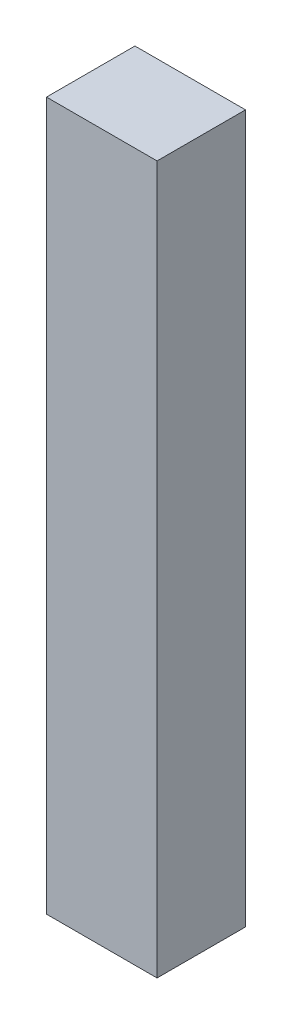
ISO-10303-21;
HEADER;
FILE_DESCRIPTION(('STEP AP214'),'2;1');
FILE_NAME('part.step','',(''),(''),'','','');
FILE_SCHEMA(('AUTOMOTIVE_DESIGN { 1 0 10303 214 1 1 1 1 }'));
ENDSEC;
DATA;
#1=APPLICATION_CONTEXT('core data for automotive mechanical design processes');
#2=APPLICATION_PROTOCOL_DEFINITION('international standard','automotive_design',2000,#1);
#3=PRODUCT_CONTEXT('',#1,'mechanical');
#4=PRODUCT('Part','Part','',(#3));
#5=PRODUCT_RELATED_PRODUCT_CATEGORY('part','',(#4));
#6=PRODUCT_DEFINITION_FORMATION('','',#4);
#7=PRODUCT_DEFINITION_CONTEXT('part definition',#1,'design');
#8=PRODUCT_DEFINITION('design','',#6,#7);
#9=PRODUCT_DEFINITION_SHAPE('','',#8);
#10=(LENGTH_UNIT() NAMED_UNIT(*) SI_UNIT(.MILLI.,.METRE.));
#11=(NAMED_UNIT(*) PLANE_ANGLE_UNIT() SI_UNIT($,.RADIAN.));
#12=(NAMED_UNIT(*) SI_UNIT($,.STERADIAN.) SOLID_ANGLE_UNIT());
#13=UNCERTAINTY_MEASURE_WITH_UNIT(LENGTH_MEASURE(1.E-05),#10,'distance_accuracy_value','');
#14=(GEOMETRIC_REPRESENTATION_CONTEXT(3) GLOBAL_UNCERTAINTY_ASSIGNED_CONTEXT((#13)) GLOBAL_UNIT_ASSIGNED_CONTEXT((#10,
#11,#12)) REPRESENTATION_CONTEXT('',''));
#15=CARTESIAN_POINT('',(0.,0.,0.));
#16=DIRECTION('',(0.,0.,1.));
#17=DIRECTION('',(1.,0.,0.));
#18=AXIS2_PLACEMENT_3D('',#15,#16,#17);
#19=CARTESIAN_POINT('',(125.,800.,200.));
#20=DIRECTION('',(-1.,0.,0.));
#21=DIRECTION('',(0.,-1.,0.));
#22=AXIS2_PLACEMENT_3D('',#19,#20,#21);
#23=PLANE('',#22);
#24=DIRECTION('',(0.,1.,0.));
#25=VECTOR('',#24,1.);
#26=CARTESIAN_POINT('',(125.,800.,0.));
#27=LINE('',#26,#25);
#28=CARTESIAN_POINT('',(125.,-800.,0.));
#29=VERTEX_POINT('',#28);
#30=CARTESIAN_POINT('',(125.,800.,0.));
#31=VERTEX_POINT('',#30);
#32=EDGE_CURVE('E107',#29,#31,#27,.T.);
#33=ORIENTED_EDGE('',*,*,#32,.T.);
#34=DIRECTION('',(0.,0.,-1.));
#35=VECTOR('',#34,1.);
#36=CARTESIAN_POINT('',(125.,800.,200.));
#37=LINE('',#36,#35);
#38=CARTESIAN_POINT('',(125.,800.,200.));
#39=VERTEX_POINT('',#38);
#40=EDGE_CURVE('E11',#39,#31,#37,.T.);
#41=ORIENTED_EDGE('',*,*,#40,.F.);
#42=DIRECTION('',(0.,1.,0.));
#43=VECTOR('',#42,1.);
#44=CARTESIAN_POINT('',(125.,800.,200.));
#45=LINE('',#44,#43);
#46=CARTESIAN_POINT('',(125.,-800.,200.));
#47=VERTEX_POINT('',#46);
#48=EDGE_CURVE('E91',#47,#39,#45,.T.);
#49=ORIENTED_EDGE('',*,*,#48,.F.);
#50=DIRECTION('',(0.,0.,-1.));
#51=VECTOR('',#50,1.);
#52=CARTESIAN_POINT('',(125.,-800.,200.));
#53=LINE('',#52,#51);
#54=EDGE_CURVE('E103',#47,#29,#53,.T.);
#55=ORIENTED_EDGE('',*,*,#54,.T.);
#56=EDGE_LOOP('',(#33,#41,#49,#55));
#57=FACE_BOUND('',#56,.T.);
#58=ADVANCED_FACE('F39',(#57),#23,.F.);
#59=CARTESIAN_POINT('',(-125.,800.,200.));
#60=DIRECTION('',(0.,-1.,0.));
#61=DIRECTION('',(0.,0.,-1.));
#62=AXIS2_PLACEMENT_3D('',#59,#60,#61);
#63=PLANE('',#62);
#64=DIRECTION('',(-1.,0.,0.));
#65=VECTOR('',#64,1.);
#66=CARTESIAN_POINT('',(-125.,800.,0.));
#67=LINE('',#66,#65);
#68=CARTESIAN_POINT('',(-125.,800.,0.));
#69=VERTEX_POINT('',#68);
#70=EDGE_CURVE('E96',#31,#69,#67,.T.);
#71=ORIENTED_EDGE('',*,*,#70,.T.);
#72=DIRECTION('',(0.,0.,-1.));
#73=VECTOR('',#72,1.);
#74=CARTESIAN_POINT('',(-125.,800.,200.));
#75=LINE('',#74,#73);
#76=CARTESIAN_POINT('',(-125.,800.,200.));
#77=VERTEX_POINT('',#76);
#78=EDGE_CURVE('E48',#77,#69,#75,.T.);
#79=ORIENTED_EDGE('',*,*,#78,.F.);
#80=DIRECTION('',(-1.,0.,0.));
#81=VECTOR('',#80,1.);
#82=CARTESIAN_POINT('',(-125.,800.,200.));
#83=LINE('',#82,#81);
#84=EDGE_CURVE('E86',#39,#77,#83,.T.);
#85=ORIENTED_EDGE('',*,*,#84,.F.);
#86=ORIENTED_EDGE('',*,*,#40,.T.);
#87=EDGE_LOOP('',(#71,#79,#85,#86));
#88=FACE_BOUND('',#87,.T.);
#89=ADVANCED_FACE('F95',(#88),#63,.F.);
#90=CARTESIAN_POINT('',(-125.,800.,200.));
#91=DIRECTION('',(1.,0.,0.));
#92=DIRECTION('',(0.,1.,0.));
#93=AXIS2_PLACEMENT_3D('',#90,#91,#92);
#94=PLANE('',#93);
#95=DIRECTION('',(0.,-1.,0.));
#96=VECTOR('',#95,1.);
#97=CARTESIAN_POINT('',(-125.,800.,0.));
#98=LINE('',#97,#96);
#99=CARTESIAN_POINT('',(-125.,-800.,0.));
#100=VERTEX_POINT('',#99);
#101=EDGE_CURVE('E73',#69,#100,#98,.T.);
#102=ORIENTED_EDGE('',*,*,#101,.T.);
#103=DIRECTION('',(0.,0.,-1.));
#104=VECTOR('',#103,1.);
#105=CARTESIAN_POINT('',(-125.,-800.,200.));
#106=LINE('',#105,#104);
#107=CARTESIAN_POINT('',(-125.,-800.,200.));
#108=VERTEX_POINT('',#107);
#109=EDGE_CURVE('E98',#108,#100,#106,.T.);
#110=ORIENTED_EDGE('',*,*,#109,.F.);
#111=DIRECTION('',(0.,-1.,0.));
#112=VECTOR('',#111,1.);
#113=CARTESIAN_POINT('',(-125.,800.,200.));
#114=LINE('',#113,#112);
#115=EDGE_CURVE('E89',#77,#108,#114,.T.);
#116=ORIENTED_EDGE('',*,*,#115,.F.);
#117=ORIENTED_EDGE('',*,*,#78,.T.);
#118=EDGE_LOOP('',(#102,#110,#116,#117));
#119=FACE_BOUND('',#118,.T.);
#120=ADVANCED_FACE('F99',(#119),#94,.F.);
#121=CARTESIAN_POINT('',(-125.,-800.,200.));
#122=DIRECTION('',(0.,1.,0.));
#123=DIRECTION('',(0.,0.,1.));
#124=AXIS2_PLACEMENT_3D('',#121,#122,#123);
#125=PLANE('',#124);
#126=DIRECTION('',(1.,0.,0.));
#127=VECTOR('',#126,1.);
#128=CARTESIAN_POINT('',(-125.,-800.,0.));
#129=LINE('',#128,#127);
#130=EDGE_CURVE('E79',#100,#29,#129,.T.);
#131=ORIENTED_EDGE('',*,*,#130,.T.);
#132=ORIENTED_EDGE('',*,*,#54,.F.);
#133=DIRECTION('',(1.,0.,0.));
#134=VECTOR('',#133,1.);
#135=CARTESIAN_POINT('',(-125.,-800.,200.));
#136=LINE('',#135,#134);
#137=EDGE_CURVE('E56',#108,#47,#136,.T.);
#138=ORIENTED_EDGE('',*,*,#137,.F.);
#139=ORIENTED_EDGE('',*,*,#109,.T.);
#140=EDGE_LOOP('',(#131,#132,#138,#139));
#141=FACE_BOUND('',#140,.T.);
#142=ADVANCED_FACE('F120',(#141),#125,.F.);
#143=CARTESIAN_POINT('',(0.,0.,200.));
#144=DIRECTION('',(0.,0.,1.));
#145=DIRECTION('',(1.,0.,0.));
#146=AXIS2_PLACEMENT_3D('',#143,#144,#145);
#147=PLANE('',#146);
#148=ORIENTED_EDGE('',*,*,#48,.T.);
#149=ORIENTED_EDGE('',*,*,#84,.T.);
#150=ORIENTED_EDGE('',*,*,#115,.T.);
#151=ORIENTED_EDGE('',*,*,#137,.T.);
#152=EDGE_LOOP('',(#148,#149,#150,#151));
#153=FACE_BOUND('',#152,.T.);
#154=ADVANCED_FACE('F87',(#153),#147,.T.);
#155=CARTESIAN_POINT('',(0.,0.,0.));
#156=DIRECTION('',(0.,0.,1.));
#157=DIRECTION('',(1.,0.,0.));
#158=AXIS2_PLACEMENT_3D('',#155,#156,#157);
#159=PLANE('',#158);
#160=ORIENTED_EDGE('',*,*,#32,.F.);
#161=ORIENTED_EDGE('',*,*,#130,.F.);
#162=ORIENTED_EDGE('',*,*,#101,.F.);
#163=ORIENTED_EDGE('',*,*,#70,.F.);
#164=EDGE_LOOP('',(#160,#161,#162,#163));
#165=FACE_BOUND('',#164,.T.);
#166=ADVANCED_FACE('F123',(#165),#159,.F.);
#167=CLOSED_SHELL('',(#58,#89,#120,#142,#154,#166));
#168=MANIFOLD_SOLID_BREP('B2',#167);
#169=ADVANCED_BREP_SHAPE_REPRESENTATION('',(#18,#168),#14);
#170=SHAPE_DEFINITION_REPRESENTATION(#9,#169);
ENDSEC;
END-ISO-10303-21;
